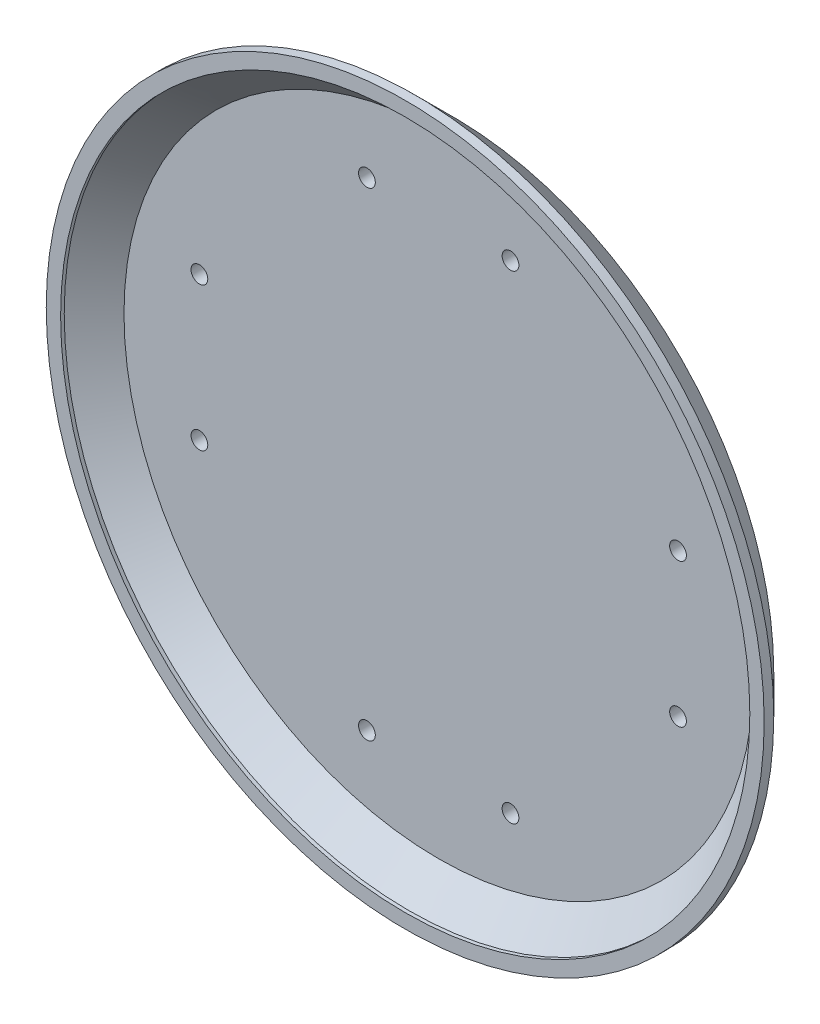
ISO-10303-21;
HEADER;
FILE_DESCRIPTION(('STEP AP214'),'2;1');
FILE_NAME('part.step','',(''),(''),'','','');
FILE_SCHEMA(('AUTOMOTIVE_DESIGN { 1 0 10303 214 1 1 1 1 }'));
ENDSEC;
DATA;
#1=APPLICATION_CONTEXT('core data for automotive mechanical design processes');
#2=APPLICATION_PROTOCOL_DEFINITION('international standard','automotive_design',2000,#1);
#3=PRODUCT_CONTEXT('',#1,'mechanical');
#4=PRODUCT('Part','Part','',(#3));
#5=PRODUCT_RELATED_PRODUCT_CATEGORY('part','',(#4));
#6=PRODUCT_DEFINITION_FORMATION('','',#4);
#7=PRODUCT_DEFINITION_CONTEXT('part definition',#1,'design');
#8=PRODUCT_DEFINITION('design','',#6,#7);
#9=PRODUCT_DEFINITION_SHAPE('','',#8);
#10=(LENGTH_UNIT() NAMED_UNIT(*) SI_UNIT(.MILLI.,.METRE.));
#11=(NAMED_UNIT(*) PLANE_ANGLE_UNIT() SI_UNIT($,.RADIAN.));
#12=(NAMED_UNIT(*) SI_UNIT($,.STERADIAN.) SOLID_ANGLE_UNIT());
#13=UNCERTAINTY_MEASURE_WITH_UNIT(LENGTH_MEASURE(1.E-05),#10,'distance_accuracy_value','');
#14=(GEOMETRIC_REPRESENTATION_CONTEXT(3) GLOBAL_UNCERTAINTY_ASSIGNED_CONTEXT((#13)) GLOBAL_UNIT_ASSIGNED_CONTEXT((#10,
#11,#12)) REPRESENTATION_CONTEXT('',''));
#15=CARTESIAN_POINT('',(0.,0.,0.));
#16=DIRECTION('',(0.,0.,1.));
#17=DIRECTION('',(1.,0.,0.));
#18=AXIS2_PLACEMENT_3D('',#15,#16,#17);
#19=CARTESIAN_POINT('',(0.,0.,10.));
#20=DIRECTION('',(0.,0.,-1.));
#21=DIRECTION('',(-1.,0.,0.));
#22=AXIS2_PLACEMENT_3D('',#19,#20,#21);
#23=CYLINDRICAL_SURFACE('',#22,75.);
#24=CARTESIAN_POINT('',(0.,0.,8.00000000000001));
#25=DIRECTION('',(0.,0.,1.));
#26=DIRECTION('',(1.,0.,0.));
#27=AXIS2_PLACEMENT_3D('',#24,#25,#26);
#28=CIRCLE('',#27,75.);
#29=CARTESIAN_POINT('',(75.,0.,8.00000000000001));
#30=VERTEX_POINT('',#29);
#31=EDGE_CURVE('E46',#30,#30,#28,.T.);
#32=ORIENTED_EDGE('',*,*,#31,.T.);
#33=EDGE_LOOP('',(#32));
#34=FACE_BOUND('',#33,.T.);
#35=CARTESIAN_POINT('',(0.,0.,10.));
#36=DIRECTION('',(0.,0.,1.));
#37=DIRECTION('',(1.,0.,0.));
#38=AXIS2_PLACEMENT_3D('',#35,#36,#37);
#39=CIRCLE('',#38,75.);
#40=CARTESIAN_POINT('',(75.,0.,10.));
#41=VERTEX_POINT('',#40);
#42=EDGE_CURVE('E51',#41,#41,#39,.T.);
#43=ORIENTED_EDGE('',*,*,#42,.F.);
#44=EDGE_LOOP('',(#43));
#45=FACE_BOUND('',#44,.T.);
#46=ADVANCED_FACE('F37',(#34,#45),#23,.T.);
#47=CARTESIAN_POINT('',(0.,0.,10.));
#48=DIRECTION('',(0.,0.,1.));
#49=DIRECTION('',(1.,0.,0.));
#50=AXIS2_PLACEMENT_3D('',#47,#48,#49);
#51=PLANE('',#50);
#52=CARTESIAN_POINT('',(0.,0.,10.));
#53=DIRECTION('',(0.,0.,1.));
#54=DIRECTION('',(1.,0.,0.));
#55=AXIS2_PLACEMENT_3D('',#52,#53,#54);
#56=CIRCLE('',#55,72.);
#57=CARTESIAN_POINT('',(72.,0.,10.));
#58=VERTEX_POINT('',#57);
#59=EDGE_CURVE('E78',#58,#58,#56,.T.);
#60=ORIENTED_EDGE('',*,*,#59,.F.);
#61=EDGE_LOOP('',(#60));
#62=FACE_BOUND('',#61,.T.);
#63=ORIENTED_EDGE('',*,*,#42,.T.);
#64=EDGE_LOOP('',(#63));
#65=FACE_BOUND('',#64,.T.);
#66=ADVANCED_FACE('F114',(#62,#65),#51,.T.);
#67=CARTESIAN_POINT('',(0.,0.,0.));
#68=DIRECTION('',(0.,0.,1.));
#69=DIRECTION('',(1.,0.,0.));
#70=AXIS2_PLACEMENT_3D('',#67,#68,#69);
#71=PLANE('',#70);
#72=CARTESIAN_POINT('',(-50.,15.,0.));
#73=DIRECTION('',(0.,0.,-1.));
#74=DIRECTION('',(-1.,0.,0.));
#75=AXIS2_PLACEMENT_3D('',#72,#73,#74);
#76=CIRCLE('',#75,1.75);
#77=CARTESIAN_POINT('',(-51.75,15.,0.));
#78=VERTEX_POINT('',#77);
#79=EDGE_CURVE('E133',#78,#78,#76,.T.);
#80=ORIENTED_EDGE('',*,*,#79,.F.);
#81=EDGE_LOOP('',(#80));
#82=FACE_BOUND('',#81,.T.);
#83=CARTESIAN_POINT('',(15.,50.,0.));
#84=DIRECTION('',(0.,0.,-1.));
#85=DIRECTION('',(-1.,0.,0.));
#86=AXIS2_PLACEMENT_3D('',#83,#84,#85);
#87=CIRCLE('',#86,1.75);
#88=CARTESIAN_POINT('',(13.25,50.,0.));
#89=VERTEX_POINT('',#88);
#90=EDGE_CURVE('E137',#89,#89,#87,.T.);
#91=ORIENTED_EDGE('',*,*,#90,.F.);
#92=EDGE_LOOP('',(#91));
#93=FACE_BOUND('',#92,.T.);
#94=CARTESIAN_POINT('',(-15.,50.,0.));
#95=DIRECTION('',(0.,0.,-1.));
#96=DIRECTION('',(-1.,0.,0.));
#97=AXIS2_PLACEMENT_3D('',#94,#95,#96);
#98=CIRCLE('',#97,1.75);
#99=CARTESIAN_POINT('',(-16.75,50.,0.));
#100=VERTEX_POINT('',#99);
#101=EDGE_CURVE('E141',#100,#100,#98,.T.);
#102=ORIENTED_EDGE('',*,*,#101,.F.);
#103=EDGE_LOOP('',(#102));
#104=FACE_BOUND('',#103,.T.);
#105=CARTESIAN_POINT('',(-50.,-15.,0.));
#106=DIRECTION('',(0.,0.,-1.));
#107=DIRECTION('',(-1.,0.,0.));
#108=AXIS2_PLACEMENT_3D('',#105,#106,#107);
#109=CIRCLE('',#108,1.75);
#110=CARTESIAN_POINT('',(-51.75,-15.,0.));
#111=VERTEX_POINT('',#110);
#112=EDGE_CURVE('E145',#111,#111,#109,.T.);
#113=ORIENTED_EDGE('',*,*,#112,.F.);
#114=EDGE_LOOP('',(#113));
#115=FACE_BOUND('',#114,.T.);
#116=CARTESIAN_POINT('',(-15.,-50.,0.));
#117=DIRECTION('',(0.,0.,-1.));
#118=DIRECTION('',(-1.,0.,0.));
#119=AXIS2_PLACEMENT_3D('',#116,#117,#118);
#120=CIRCLE('',#119,1.75);
#121=CARTESIAN_POINT('',(-16.75,-50.,0.));
#122=VERTEX_POINT('',#121);
#123=EDGE_CURVE('E149',#122,#122,#120,.T.);
#124=ORIENTED_EDGE('',*,*,#123,.F.);
#125=EDGE_LOOP('',(#124));
#126=FACE_BOUND('',#125,.T.);
#127=CARTESIAN_POINT('',(15.,-50.,0.));
#128=DIRECTION('',(0.,0.,-1.));
#129=DIRECTION('',(-1.,0.,0.));
#130=AXIS2_PLACEMENT_3D('',#127,#128,#129);
#131=CIRCLE('',#130,1.75);
#132=CARTESIAN_POINT('',(13.25,-50.,0.));
#133=VERTEX_POINT('',#132);
#134=EDGE_CURVE('E153',#133,#133,#131,.T.);
#135=ORIENTED_EDGE('',*,*,#134,.F.);
#136=EDGE_LOOP('',(#135));
#137=FACE_BOUND('',#136,.T.);
#138=CARTESIAN_POINT('',(50.,-15.,0.));
#139=DIRECTION('',(0.,0.,-1.));
#140=DIRECTION('',(-1.,0.,0.));
#141=AXIS2_PLACEMENT_3D('',#138,#139,#140);
#142=CIRCLE('',#141,1.75);
#143=CARTESIAN_POINT('',(48.25,-15.,0.));
#144=VERTEX_POINT('',#143);
#145=EDGE_CURVE('E157',#144,#144,#142,.T.);
#146=ORIENTED_EDGE('',*,*,#145,.F.);
#147=EDGE_LOOP('',(#146));
#148=FACE_BOUND('',#147,.T.);
#149=CARTESIAN_POINT('',(50.,15.,0.));
#150=DIRECTION('',(0.,0.,-1.));
#151=DIRECTION('',(-1.,0.,0.));
#152=AXIS2_PLACEMENT_3D('',#149,#150,#151);
#153=CIRCLE('',#152,1.75);
#154=CARTESIAN_POINT('',(48.25,15.,0.));
#155=VERTEX_POINT('',#154);
#156=EDGE_CURVE('E59',#155,#155,#153,.T.);
#157=ORIENTED_EDGE('',*,*,#156,.F.);
#158=EDGE_LOOP('',(#157));
#159=FACE_BOUND('',#158,.T.);
#160=CARTESIAN_POINT('',(0.,0.,0.));
#161=DIRECTION('',(0.,0.,1.));
#162=DIRECTION('',(1.,0.,0.));
#163=AXIS2_PLACEMENT_3D('',#160,#161,#162);
#164=CIRCLE('',#163,67.);
#165=CARTESIAN_POINT('',(67.,0.,0.));
#166=VERTEX_POINT('',#165);
#167=EDGE_CURVE('E10',#166,#166,#164,.F.);
#168=ORIENTED_EDGE('',*,*,#167,.T.);
#169=EDGE_LOOP('',(#168));
#170=FACE_BOUND('',#169,.T.);
#171=ADVANCED_FACE('F119',(#82,#93,#104,#115,#126,#137,#148,#159,#170),#71,.F.);
#172=CARTESIAN_POINT('',(0.,0.,8.00000000000001));
#173=DIRECTION('',(0.,0.,1.));
#174=DIRECTION('',(1.,0.,0.));
#175=AXIS2_PLACEMENT_3D('',#172,#173,#174);
#176=CONICAL_SURFACE('',#175,75.,0.785398163397449);
#177=ORIENTED_EDGE('',*,*,#167,.F.);
#178=EDGE_LOOP('',(#177));
#179=FACE_BOUND('',#178,.T.);
#180=ORIENTED_EDGE('',*,*,#31,.F.);
#181=EDGE_LOOP('',(#180));
#182=FACE_BOUND('',#181,.T.);
#183=ADVANCED_FACE('F40',(#179,#182),#176,.T.);
#184=CARTESIAN_POINT('',(0.,0.,10.));
#185=DIRECTION('',(0.,0.,-1.));
#186=DIRECTION('',(-1.,0.,0.));
#187=AXIS2_PLACEMENT_3D('',#184,#185,#186);
#188=CYLINDRICAL_SURFACE('',#187,72.);
#189=CARTESIAN_POINT('',(0.,0.,9.24264068711929));
#190=DIRECTION('',(0.,0.,1.));
#191=DIRECTION('',(1.,0.,0.));
#192=AXIS2_PLACEMENT_3D('',#189,#190,#191);
#193=CIRCLE('',#192,72.);
#194=CARTESIAN_POINT('',(72.,0.,9.24264068711929));
#195=VERTEX_POINT('',#194);
#196=EDGE_CURVE('E82',#195,#195,#193,.T.);
#197=ORIENTED_EDGE('',*,*,#196,.F.);
#198=EDGE_LOOP('',(#197));
#199=FACE_BOUND('',#198,.T.);
#200=ORIENTED_EDGE('',*,*,#59,.T.);
#201=EDGE_LOOP('',(#200));
#202=FACE_BOUND('',#201,.T.);
#203=ADVANCED_FACE('F101',(#199,#202),#188,.F.);
#204=CARTESIAN_POINT('',(0.,0.,3.));
#205=DIRECTION('',(0.,0.,1.));
#206=DIRECTION('',(1.,0.,0.));
#207=AXIS2_PLACEMENT_3D('',#204,#205,#206);
#208=PLANE('',#207);
#209=CARTESIAN_POINT('',(-50.,15.,3.));
#210=DIRECTION('',(0.,0.,1.));
#211=DIRECTION('',(1.,0.,0.));
#212=AXIS2_PLACEMENT_3D('',#209,#210,#211);
#213=CIRCLE('',#212,1.75);
#214=CARTESIAN_POINT('',(-48.25,15.,3.));
#215=VERTEX_POINT('',#214);
#216=EDGE_CURVE('E42',#215,#215,#213,.T.);
#217=ORIENTED_EDGE('',*,*,#216,.F.);
#218=EDGE_LOOP('',(#217));
#219=FACE_BOUND('',#218,.T.);
#220=CARTESIAN_POINT('',(15.,50.,3.));
#221=DIRECTION('',(0.,0.,1.));
#222=DIRECTION('',(1.,0.,0.));
#223=AXIS2_PLACEMENT_3D('',#220,#221,#222);
#224=CIRCLE('',#223,1.75);
#225=CARTESIAN_POINT('',(16.75,50.,3.));
#226=VERTEX_POINT('',#225);
#227=EDGE_CURVE('E73',#226,#226,#224,.T.);
#228=ORIENTED_EDGE('',*,*,#227,.F.);
#229=EDGE_LOOP('',(#228));
#230=FACE_BOUND('',#229,.T.);
#231=CARTESIAN_POINT('',(-15.,50.,3.));
#232=DIRECTION('',(0.,0.,1.));
#233=DIRECTION('',(1.,0.,0.));
#234=AXIS2_PLACEMENT_3D('',#231,#232,#233);
#235=CIRCLE('',#234,1.75);
#236=CARTESIAN_POINT('',(-13.25,50.,3.));
#237=VERTEX_POINT('',#236);
#238=EDGE_CURVE('E71',#237,#237,#235,.T.);
#239=ORIENTED_EDGE('',*,*,#238,.F.);
#240=EDGE_LOOP('',(#239));
#241=FACE_BOUND('',#240,.T.);
#242=CARTESIAN_POINT('',(-50.,-15.,3.));
#243=DIRECTION('',(0.,0.,1.));
#244=DIRECTION('',(1.,0.,0.));
#245=AXIS2_PLACEMENT_3D('',#242,#243,#244);
#246=CIRCLE('',#245,1.75);
#247=CARTESIAN_POINT('',(-48.25,-15.,3.));
#248=VERTEX_POINT('',#247);
#249=EDGE_CURVE('E68',#248,#248,#246,.T.);
#250=ORIENTED_EDGE('',*,*,#249,.F.);
#251=EDGE_LOOP('',(#250));
#252=FACE_BOUND('',#251,.T.);
#253=CARTESIAN_POINT('',(-15.,-50.,3.));
#254=DIRECTION('',(0.,0.,1.));
#255=DIRECTION('',(1.,0.,0.));
#256=AXIS2_PLACEMENT_3D('',#253,#254,#255);
#257=CIRCLE('',#256,1.75);
#258=CARTESIAN_POINT('',(-13.25,-50.,3.));
#259=VERTEX_POINT('',#258);
#260=EDGE_CURVE('E65',#259,#259,#257,.T.);
#261=ORIENTED_EDGE('',*,*,#260,.F.);
#262=EDGE_LOOP('',(#261));
#263=FACE_BOUND('',#262,.T.);
#264=CARTESIAN_POINT('',(15.,-50.,3.));
#265=DIRECTION('',(0.,0.,1.));
#266=DIRECTION('',(1.,0.,0.));
#267=AXIS2_PLACEMENT_3D('',#264,#265,#266);
#268=CIRCLE('',#267,1.75);
#269=CARTESIAN_POINT('',(16.75,-50.,3.));
#270=VERTEX_POINT('',#269);
#271=EDGE_CURVE('E62',#270,#270,#268,.T.);
#272=ORIENTED_EDGE('',*,*,#271,.F.);
#273=EDGE_LOOP('',(#272));
#274=FACE_BOUND('',#273,.T.);
#275=CARTESIAN_POINT('',(50.,-15.,3.));
#276=DIRECTION('',(0.,0.,1.));
#277=DIRECTION('',(1.,0.,0.));
#278=AXIS2_PLACEMENT_3D('',#275,#276,#277);
#279=CIRCLE('',#278,1.75);
#280=CARTESIAN_POINT('',(51.75,-15.,3.));
#281=VERTEX_POINT('',#280);
#282=EDGE_CURVE('E58',#281,#281,#279,.T.);
#283=ORIENTED_EDGE('',*,*,#282,.F.);
#284=EDGE_LOOP('',(#283));
#285=FACE_BOUND('',#284,.T.);
#286=CARTESIAN_POINT('',(50.,15.,3.));
#287=DIRECTION('',(0.,0.,1.));
#288=DIRECTION('',(1.,0.,0.));
#289=AXIS2_PLACEMENT_3D('',#286,#287,#288);
#290=CIRCLE('',#289,1.75);
#291=CARTESIAN_POINT('',(51.75,15.,3.));
#292=VERTEX_POINT('',#291);
#293=EDGE_CURVE('E55',#292,#292,#290,.T.);
#294=ORIENTED_EDGE('',*,*,#293,.F.);
#295=EDGE_LOOP('',(#294));
#296=FACE_BOUND('',#295,.T.);
#297=CARTESIAN_POINT('',(0.,0.,3.));
#298=DIRECTION('',(0.,0.,1.));
#299=DIRECTION('',(1.,0.,0.));
#300=AXIS2_PLACEMENT_3D('',#297,#298,#299);
#301=CIRCLE('',#300,65.7573593128807);
#302=CARTESIAN_POINT('',(65.7573593128807,0.,3.));
#303=VERTEX_POINT('',#302);
#304=EDGE_CURVE('E87',#303,#303,#301,.F.);
#305=ORIENTED_EDGE('',*,*,#304,.F.);
#306=EDGE_LOOP('',(#305));
#307=FACE_BOUND('',#306,.T.);
#308=ADVANCED_FACE('F99',(#219,#230,#241,#252,#263,#274,#285,#296,#307),#208,.T.);
#309=CARTESIAN_POINT('',(0.,0.,10.1213203435597));
#310=DIRECTION('',(0.,0.,1.));
#311=DIRECTION('',(1.,0.,0.));
#312=AXIS2_PLACEMENT_3D('',#309,#310,#311);
#313=CONICAL_SURFACE('',#312,72.8786796564404,0.785398163397449);
#314=ORIENTED_EDGE('',*,*,#304,.T.);
#315=EDGE_LOOP('',(#314));
#316=FACE_BOUND('',#315,.T.);
#317=ORIENTED_EDGE('',*,*,#196,.T.);
#318=EDGE_LOOP('',(#317));
#319=FACE_BOUND('',#318,.T.);
#320=ADVANCED_FACE('F96',(#316,#319),#313,.F.);
#321=CARTESIAN_POINT('',(50.,15.,10.));
#322=DIRECTION('',(0.,0.,-1.));
#323=DIRECTION('',(-1.,0.,0.));
#324=AXIS2_PLACEMENT_3D('',#321,#322,#323);
#325=CYLINDRICAL_SURFACE('',#324,1.75);
#326=ORIENTED_EDGE('',*,*,#293,.T.);
#327=EDGE_LOOP('',(#326));
#328=FACE_BOUND('',#327,.T.);
#329=ORIENTED_EDGE('',*,*,#156,.T.);
#330=EDGE_LOOP('',(#329));
#331=FACE_BOUND('',#330,.T.);
#332=ADVANCED_FACE('F108',(#328,#331),#325,.F.);
#333=CARTESIAN_POINT('',(50.,-15.,10.));
#334=DIRECTION('',(0.,0.,-1.));
#335=DIRECTION('',(-1.,0.,0.));
#336=AXIS2_PLACEMENT_3D('',#333,#334,#335);
#337=CYLINDRICAL_SURFACE('',#336,1.75);
#338=ORIENTED_EDGE('',*,*,#282,.T.);
#339=EDGE_LOOP('',(#338));
#340=FACE_BOUND('',#339,.T.);
#341=ORIENTED_EDGE('',*,*,#145,.T.);
#342=EDGE_LOOP('',(#341));
#343=FACE_BOUND('',#342,.T.);
#344=ADVANCED_FACE('F173',(#340,#343),#337,.F.);
#345=CARTESIAN_POINT('',(15.,-50.,10.));
#346=DIRECTION('',(0.,0.,-1.));
#347=DIRECTION('',(-1.,0.,0.));
#348=AXIS2_PLACEMENT_3D('',#345,#346,#347);
#349=CYLINDRICAL_SURFACE('',#348,1.75);
#350=ORIENTED_EDGE('',*,*,#271,.T.);
#351=EDGE_LOOP('',(#350));
#352=FACE_BOUND('',#351,.T.);
#353=ORIENTED_EDGE('',*,*,#134,.T.);
#354=EDGE_LOOP('',(#353));
#355=FACE_BOUND('',#354,.T.);
#356=ADVANCED_FACE('F170',(#352,#355),#349,.F.);
#357=CARTESIAN_POINT('',(-15.,-50.,10.));
#358=DIRECTION('',(0.,0.,-1.));
#359=DIRECTION('',(-1.,0.,0.));
#360=AXIS2_PLACEMENT_3D('',#357,#358,#359);
#361=CYLINDRICAL_SURFACE('',#360,1.75);
#362=ORIENTED_EDGE('',*,*,#260,.T.);
#363=EDGE_LOOP('',(#362));
#364=FACE_BOUND('',#363,.T.);
#365=ORIENTED_EDGE('',*,*,#123,.T.);
#366=EDGE_LOOP('',(#365));
#367=FACE_BOUND('',#366,.T.);
#368=ADVANCED_FACE('F172',(#364,#367),#361,.F.);
#369=CARTESIAN_POINT('',(-50.,-15.,10.));
#370=DIRECTION('',(0.,0.,-1.));
#371=DIRECTION('',(-1.,0.,0.));
#372=AXIS2_PLACEMENT_3D('',#369,#370,#371);
#373=CYLINDRICAL_SURFACE('',#372,1.75);
#374=ORIENTED_EDGE('',*,*,#249,.T.);
#375=EDGE_LOOP('',(#374));
#376=FACE_BOUND('',#375,.T.);
#377=ORIENTED_EDGE('',*,*,#112,.T.);
#378=EDGE_LOOP('',(#377));
#379=FACE_BOUND('',#378,.T.);
#380=ADVANCED_FACE('F180',(#376,#379),#373,.F.);
#381=CARTESIAN_POINT('',(-15.,50.,10.));
#382=DIRECTION('',(0.,0.,-1.));
#383=DIRECTION('',(-1.,0.,0.));
#384=AXIS2_PLACEMENT_3D('',#381,#382,#383);
#385=CYLINDRICAL_SURFACE('',#384,1.75);
#386=ORIENTED_EDGE('',*,*,#238,.T.);
#387=EDGE_LOOP('',(#386));
#388=FACE_BOUND('',#387,.T.);
#389=ORIENTED_EDGE('',*,*,#101,.T.);
#390=EDGE_LOOP('',(#389));
#391=FACE_BOUND('',#390,.T.);
#392=ADVANCED_FACE('F188',(#388,#391),#385,.F.);
#393=CARTESIAN_POINT('',(15.,50.,10.));
#394=DIRECTION('',(0.,0.,-1.));
#395=DIRECTION('',(-1.,0.,0.));
#396=AXIS2_PLACEMENT_3D('',#393,#394,#395);
#397=CYLINDRICAL_SURFACE('',#396,1.75);
#398=ORIENTED_EDGE('',*,*,#227,.T.);
#399=EDGE_LOOP('',(#398));
#400=FACE_BOUND('',#399,.T.);
#401=ORIENTED_EDGE('',*,*,#90,.T.);
#402=EDGE_LOOP('',(#401));
#403=FACE_BOUND('',#402,.T.);
#404=ADVANCED_FACE('F192',(#400,#403),#397,.F.);
#405=CARTESIAN_POINT('',(-50.,15.,10.));
#406=DIRECTION('',(0.,0.,-1.));
#407=DIRECTION('',(-1.,0.,0.));
#408=AXIS2_PLACEMENT_3D('',#405,#406,#407);
#409=CYLINDRICAL_SURFACE('',#408,1.75);
#410=ORIENTED_EDGE('',*,*,#216,.T.);
#411=EDGE_LOOP('',(#410));
#412=FACE_BOUND('',#411,.T.);
#413=ORIENTED_EDGE('',*,*,#79,.T.);
#414=EDGE_LOOP('',(#413));
#415=FACE_BOUND('',#414,.T.);
#416=ADVANCED_FACE('F194',(#412,#415),#409,.F.);
#417=CLOSED_SHELL('',(#46,#66,#171,#183,#203,#308,#320,#332,#344,#356,#368,#380,#392,#404,#416));
#418=MANIFOLD_SOLID_BREP('B2',#417);
#419=ADVANCED_BREP_SHAPE_REPRESENTATION('',(#18,#418),#14);
#420=SHAPE_DEFINITION_REPRESENTATION(#9,#419);
ENDSEC;
END-ISO-10303-21;
